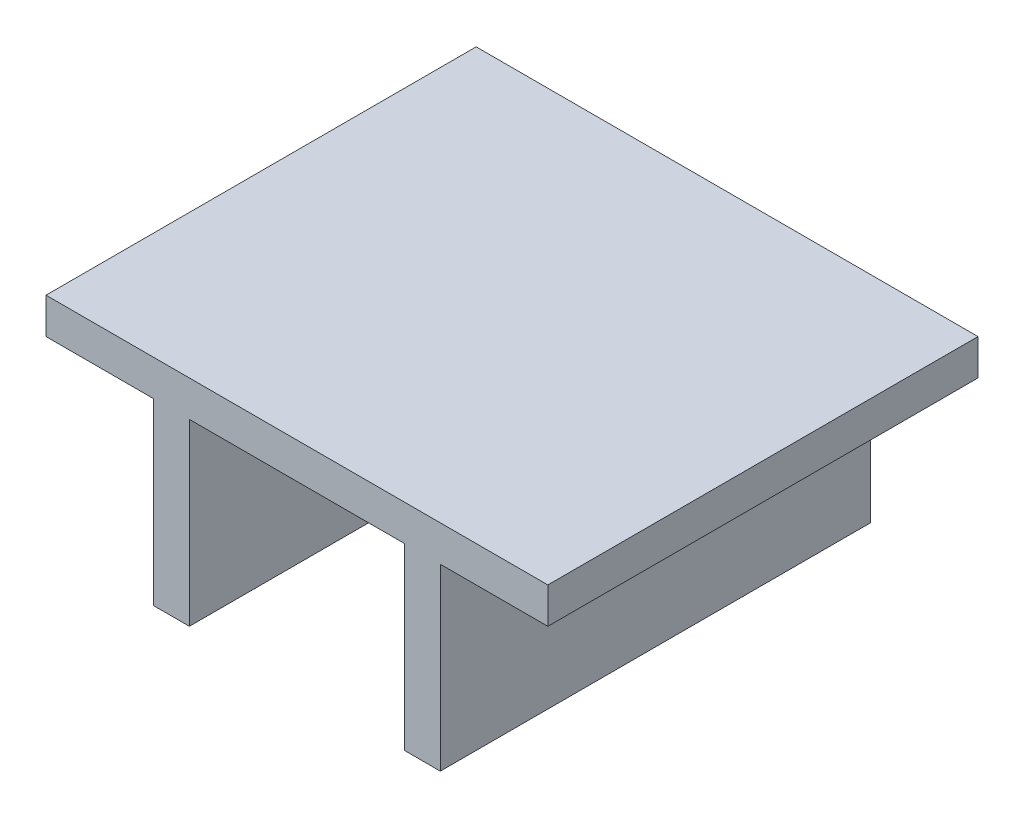
ISO-10303-21;
HEADER;
FILE_DESCRIPTION(('STEP AP214'),'2;1');
FILE_NAME('part.step','',(''),(''),'','','');
FILE_SCHEMA(('AUTOMOTIVE_DESIGN { 1 0 10303 214 1 1 1 1 }'));
ENDSEC;
DATA;
#1=APPLICATION_CONTEXT('core data for automotive mechanical design processes');
#2=APPLICATION_PROTOCOL_DEFINITION('international standard','automotive_design',2000,#1);
#3=PRODUCT_CONTEXT('',#1,'mechanical');
#4=PRODUCT('Part','Part','',(#3));
#5=PRODUCT_RELATED_PRODUCT_CATEGORY('part','',(#4));
#6=PRODUCT_DEFINITION_FORMATION('','',#4);
#7=PRODUCT_DEFINITION_CONTEXT('part definition',#1,'design');
#8=PRODUCT_DEFINITION('design','',#6,#7);
#9=PRODUCT_DEFINITION_SHAPE('','',#8);
#10=(LENGTH_UNIT() NAMED_UNIT(*) SI_UNIT(.MILLI.,.METRE.));
#11=(NAMED_UNIT(*) PLANE_ANGLE_UNIT() SI_UNIT($,.RADIAN.));
#12=(NAMED_UNIT(*) SI_UNIT($,.STERADIAN.) SOLID_ANGLE_UNIT());
#13=UNCERTAINTY_MEASURE_WITH_UNIT(LENGTH_MEASURE(1.E-05),#10,'distance_accuracy_value','');
#14=(GEOMETRIC_REPRESENTATION_CONTEXT(3) GLOBAL_UNCERTAINTY_ASSIGNED_CONTEXT((#13)) GLOBAL_UNIT_ASSIGNED_CONTEXT((#10,
#11,#12)) REPRESENTATION_CONTEXT('',''));
#15=CARTESIAN_POINT('',(0.,0.,0.));
#16=DIRECTION('',(0.,0.,1.));
#17=DIRECTION('',(1.,0.,0.));
#18=AXIS2_PLACEMENT_3D('',#15,#16,#17);
#19=CARTESIAN_POINT('',(0.,0.,76.2));
#20=DIRECTION('',(1.,0.,0.));
#21=DIRECTION('',(0.,1.,0.));
#22=AXIS2_PLACEMENT_3D('',#19,#20,#21);
#23=PLANE('',#22);
#24=DIRECTION('',(0.,-1.,0.));
#25=VECTOR('',#24,1.);
#26=CARTESIAN_POINT('',(0.,0.,0.));
#27=LINE('',#26,#25);
#28=CARTESIAN_POINT('',(0.,0.,0.));
#29=VERTEX_POINT('',#28);
#30=CARTESIAN_POINT('',(0.,-6.35,0.));
#31=VERTEX_POINT('',#30);
#32=EDGE_CURVE('E173',#29,#31,#27,.T.);
#33=ORIENTED_EDGE('',*,*,#32,.T.);
#34=DIRECTION('',(0.,0.,-1.));
#35=VECTOR('',#34,1.);
#36=CARTESIAN_POINT('',(0.,-6.35,76.2));
#37=LINE('',#36,#35);
#38=CARTESIAN_POINT('',(0.,-6.35,76.2));
#39=VERTEX_POINT('',#38);
#40=EDGE_CURVE('E11',#39,#31,#37,.T.);
#41=ORIENTED_EDGE('',*,*,#40,.F.);
#42=DIRECTION('',(0.,-1.,0.));
#43=VECTOR('',#42,1.);
#44=CARTESIAN_POINT('',(0.,0.,76.2));
#45=LINE('',#44,#43);
#46=CARTESIAN_POINT('',(0.,0.,76.2));
#47=VERTEX_POINT('',#46);
#48=EDGE_CURVE('E208',#47,#39,#45,.T.);
#49=ORIENTED_EDGE('',*,*,#48,.F.);
#50=DIRECTION('',(0.,0.,-1.));
#51=VECTOR('',#50,1.);
#52=CARTESIAN_POINT('',(0.,0.,76.2));
#53=LINE('',#52,#51);
#54=EDGE_CURVE('E62',#47,#29,#53,.T.);
#55=ORIENTED_EDGE('',*,*,#54,.T.);
#56=EDGE_LOOP('',(#33,#41,#49,#55));
#57=FACE_BOUND('',#56,.T.);
#58=ADVANCED_FACE('F45',(#57),#23,.F.);
#59=CARTESIAN_POINT('',(0.,-6.35,76.2));
#60=DIRECTION('',(0.,1.,0.));
#61=DIRECTION('',(-1.,0.,0.));
#62=AXIS2_PLACEMENT_3D('',#59,#60,#61);
#63=PLANE('',#62);
#64=DIRECTION('',(1.,0.,0.));
#65=VECTOR('',#64,1.);
#66=CARTESIAN_POINT('',(0.,-6.35,0.));
#67=LINE('',#66,#65);
#68=CARTESIAN_POINT('',(19.05,-6.35,0.));
#69=VERTEX_POINT('',#68);
#70=EDGE_CURVE('E176',#31,#69,#67,.T.);
#71=ORIENTED_EDGE('',*,*,#70,.T.);
#72=DIRECTION('',(0.,0.,-1.));
#73=VECTOR('',#72,1.);
#74=CARTESIAN_POINT('',(19.05,-6.35,76.2));
#75=LINE('',#74,#73);
#76=CARTESIAN_POINT('',(19.05,-6.35,76.2));
#77=VERTEX_POINT('',#76);
#78=EDGE_CURVE('E54',#77,#69,#75,.T.);
#79=ORIENTED_EDGE('',*,*,#78,.F.);
#80=DIRECTION('',(1.,0.,0.));
#81=VECTOR('',#80,1.);
#82=CARTESIAN_POINT('',(0.,-6.35,76.2));
#83=LINE('',#82,#81);
#84=EDGE_CURVE('E112',#39,#77,#83,.T.);
#85=ORIENTED_EDGE('',*,*,#84,.F.);
#86=ORIENTED_EDGE('',*,*,#40,.T.);
#87=EDGE_LOOP('',(#71,#79,#85,#86));
#88=FACE_BOUND('',#87,.T.);
#89=ADVANCED_FACE('F242',(#88),#63,.F.);
#90=CARTESIAN_POINT('',(19.05,0.,76.2));
#91=DIRECTION('',(-1.,0.,0.));
#92=DIRECTION('',(0.,0.,1.));
#93=AXIS2_PLACEMENT_3D('',#90,#91,#92);
#94=PLANE('',#93);
#95=DIRECTION('',(0.,1.,0.));
#96=VECTOR('',#95,1.);
#97=CARTESIAN_POINT('',(19.05,0.,0.));
#98=LINE('',#97,#96);
#99=CARTESIAN_POINT('',(19.05,-38.1,0.));
#100=VERTEX_POINT('',#99);
#101=EDGE_CURVE('E180',#100,#69,#98,.T.);
#102=ORIENTED_EDGE('',*,*,#101,.F.);
#103=DIRECTION('',(0.,0.,-1.));
#104=VECTOR('',#103,1.);
#105=CARTESIAN_POINT('',(19.05,-38.1,76.2));
#106=LINE('',#105,#104);
#107=CARTESIAN_POINT('',(19.05,-38.1,76.2));
#108=VERTEX_POINT('',#107);
#109=EDGE_CURVE('E233',#108,#100,#106,.T.);
#110=ORIENTED_EDGE('',*,*,#109,.F.);
#111=DIRECTION('',(0.,1.,0.));
#112=VECTOR('',#111,1.);
#113=CARTESIAN_POINT('',(19.05,0.,76.2));
#114=LINE('',#113,#112);
#115=EDGE_CURVE('E241',#108,#77,#114,.T.);
#116=ORIENTED_EDGE('',*,*,#115,.T.);
#117=ORIENTED_EDGE('',*,*,#78,.T.);
#118=EDGE_LOOP('',(#102,#110,#116,#117));
#119=FACE_BOUND('',#118,.T.);
#120=ADVANCED_FACE('F239',(#119),#94,.T.);
#121=CARTESIAN_POINT('',(0.,-38.1,76.2));
#122=DIRECTION('',(0.,1.,0.));
#123=DIRECTION('',(0.,0.,1.));
#124=AXIS2_PLACEMENT_3D('',#121,#122,#123);
#125=PLANE('',#124);
#126=DIRECTION('',(1.,0.,0.));
#127=VECTOR('',#126,1.);
#128=CARTESIAN_POINT('',(0.,-38.1,0.));
#129=LINE('',#128,#127);
#130=CARTESIAN_POINT('',(25.4,-38.1,0.));
#131=VERTEX_POINT('',#130);
#132=EDGE_CURVE('E185',#100,#131,#129,.T.);
#133=ORIENTED_EDGE('',*,*,#132,.T.);
#134=DIRECTION('',(0.,0.,-1.));
#135=VECTOR('',#134,1.);
#136=CARTESIAN_POINT('',(25.4,-38.1,76.2));
#137=LINE('',#136,#135);
#138=CARTESIAN_POINT('',(25.4,-38.1,76.2));
#139=VERTEX_POINT('',#138);
#140=EDGE_CURVE('E229',#139,#131,#137,.T.);
#141=ORIENTED_EDGE('',*,*,#140,.F.);
#142=DIRECTION('',(1.,0.,0.));
#143=VECTOR('',#142,1.);
#144=CARTESIAN_POINT('',(0.,-38.1,76.2));
#145=LINE('',#144,#143);
#146=EDGE_CURVE('E260',#108,#139,#145,.T.);
#147=ORIENTED_EDGE('',*,*,#146,.F.);
#148=ORIENTED_EDGE('',*,*,#109,.T.);
#149=EDGE_LOOP('',(#133,#141,#147,#148));
#150=FACE_BOUND('',#149,.T.);
#151=ADVANCED_FACE('F251',(#150),#125,.F.);
#152=CARTESIAN_POINT('',(25.4,0.,76.2));
#153=DIRECTION('',(-1.,0.,0.));
#154=DIRECTION('',(0.,0.,1.));
#155=AXIS2_PLACEMENT_3D('',#152,#153,#154);
#156=PLANE('',#155);
#157=DIRECTION('',(0.,1.,0.));
#158=VECTOR('',#157,1.);
#159=CARTESIAN_POINT('',(25.4,0.,0.));
#160=LINE('',#159,#158);
#161=CARTESIAN_POINT('',(25.4,-6.35,0.));
#162=VERTEX_POINT('',#161);
#163=EDGE_CURVE('E188',#131,#162,#160,.T.);
#164=ORIENTED_EDGE('',*,*,#163,.T.);
#165=DIRECTION('',(0.,0.,-1.));
#166=VECTOR('',#165,1.);
#167=CARTESIAN_POINT('',(25.4,-6.35,76.2));
#168=LINE('',#167,#166);
#169=CARTESIAN_POINT('',(25.4,-6.35,76.2));
#170=VERTEX_POINT('',#169);
#171=EDGE_CURVE('E225',#170,#162,#168,.T.);
#172=ORIENTED_EDGE('',*,*,#171,.F.);
#173=DIRECTION('',(0.,1.,0.));
#174=VECTOR('',#173,1.);
#175=CARTESIAN_POINT('',(25.4,0.,76.2));
#176=LINE('',#175,#174);
#177=EDGE_CURVE('E257',#139,#170,#176,.T.);
#178=ORIENTED_EDGE('',*,*,#177,.F.);
#179=ORIENTED_EDGE('',*,*,#140,.T.);
#180=EDGE_LOOP('',(#164,#172,#178,#179));
#181=FACE_BOUND('',#180,.T.);
#182=ADVANCED_FACE('F255',(#181),#156,.F.);
#183=CARTESIAN_POINT('',(63.5,-6.35,0.));
#184=VERTEX_POINT('',#183);
#185=EDGE_CURVE('E181',#162,#184,#67,.T.);
#186=ORIENTED_EDGE('',*,*,#185,.T.);
#187=DIRECTION('',(0.,0.,-1.));
#188=VECTOR('',#187,1.);
#189=CARTESIAN_POINT('',(63.5,-6.35,76.2));
#190=LINE('',#189,#188);
#191=CARTESIAN_POINT('',(63.5,-6.35,76.2));
#192=VERTEX_POINT('',#191);
#193=EDGE_CURVE('E222',#192,#184,#190,.T.);
#194=ORIENTED_EDGE('',*,*,#193,.F.);
#195=EDGE_CURVE('E153',#170,#192,#83,.T.);
#196=ORIENTED_EDGE('',*,*,#195,.F.);
#197=ORIENTED_EDGE('',*,*,#171,.T.);
#198=EDGE_LOOP('',(#186,#194,#196,#197));
#199=FACE_BOUND('',#198,.T.);
#200=ADVANCED_FACE('F287',(#199),#63,.F.);
#201=CARTESIAN_POINT('',(63.5,0.,76.2));
#202=DIRECTION('',(-1.,0.,0.));
#203=DIRECTION('',(0.,0.,1.));
#204=AXIS2_PLACEMENT_3D('',#201,#202,#203);
#205=PLANE('',#204);
#206=DIRECTION('',(0.,1.,0.));
#207=VECTOR('',#206,1.);
#208=CARTESIAN_POINT('',(63.5,0.,0.));
#209=LINE('',#208,#207);
#210=CARTESIAN_POINT('',(63.5,-38.1,0.));
#211=VERTEX_POINT('',#210);
#212=EDGE_CURVE('E191',#211,#184,#209,.T.);
#213=ORIENTED_EDGE('',*,*,#212,.F.);
#214=DIRECTION('',(0.,0.,-1.));
#215=VECTOR('',#214,1.);
#216=CARTESIAN_POINT('',(63.5,-38.1,76.2));
#217=LINE('',#216,#215);
#218=CARTESIAN_POINT('',(63.5,-38.1,76.2));
#219=VERTEX_POINT('',#218);
#220=EDGE_CURVE('E219',#219,#211,#217,.T.);
#221=ORIENTED_EDGE('',*,*,#220,.F.);
#222=DIRECTION('',(0.,1.,0.));
#223=VECTOR('',#222,1.);
#224=CARTESIAN_POINT('',(63.5,0.,76.2));
#225=LINE('',#224,#223);
#226=EDGE_CURVE('E264',#219,#192,#225,.T.);
#227=ORIENTED_EDGE('',*,*,#226,.T.);
#228=ORIENTED_EDGE('',*,*,#193,.T.);
#229=EDGE_LOOP('',(#213,#221,#227,#228));
#230=FACE_BOUND('',#229,.T.);
#231=ADVANCED_FACE('F290',(#230),#205,.T.);
#232=CARTESIAN_POINT('',(0.,-38.1,76.2));
#233=DIRECTION('',(0.,1.,0.));
#234=DIRECTION('',(0.,0.,1.));
#235=AXIS2_PLACEMENT_3D('',#232,#233,#234);
#236=PLANE('',#235);
#237=DIRECTION('',(1.,0.,0.));
#238=VECTOR('',#237,1.);
#239=CARTESIAN_POINT('',(0.,-38.1,0.));
#240=LINE('',#239,#238);
#241=CARTESIAN_POINT('',(69.85,-38.1,0.));
#242=VERTEX_POINT('',#241);
#243=EDGE_CURVE('E195',#211,#242,#240,.T.);
#244=ORIENTED_EDGE('',*,*,#243,.T.);
#245=DIRECTION('',(0.,0.,-1.));
#246=VECTOR('',#245,1.);
#247=CARTESIAN_POINT('',(69.85,-38.1,76.2));
#248=LINE('',#247,#246);
#249=CARTESIAN_POINT('',(69.85,-38.1,76.2));
#250=VERTEX_POINT('',#249);
#251=EDGE_CURVE('E215',#250,#242,#248,.T.);
#252=ORIENTED_EDGE('',*,*,#251,.F.);
#253=DIRECTION('',(1.,0.,0.));
#254=VECTOR('',#253,1.);
#255=CARTESIAN_POINT('',(0.,-38.1,76.2));
#256=LINE('',#255,#254);
#257=EDGE_CURVE('E270',#219,#250,#256,.T.);
#258=ORIENTED_EDGE('',*,*,#257,.F.);
#259=ORIENTED_EDGE('',*,*,#220,.T.);
#260=EDGE_LOOP('',(#244,#252,#258,#259));
#261=FACE_BOUND('',#260,.T.);
#262=ADVANCED_FACE('F277',(#261),#236,.F.);
#263=CARTESIAN_POINT('',(69.85,0.,76.2));
#264=DIRECTION('',(-1.,0.,0.));
#265=DIRECTION('',(0.,0.,1.));
#266=AXIS2_PLACEMENT_3D('',#263,#264,#265);
#267=PLANE('',#266);
#268=DIRECTION('',(0.,1.,0.));
#269=VECTOR('',#268,1.);
#270=CARTESIAN_POINT('',(69.85,0.,0.));
#271=LINE('',#270,#269);
#272=CARTESIAN_POINT('',(69.85,-6.35,0.));
#273=VERTEX_POINT('',#272);
#274=EDGE_CURVE('E198',#242,#273,#271,.T.);
#275=ORIENTED_EDGE('',*,*,#274,.T.);
#276=DIRECTION('',(0.,0.,-1.));
#277=VECTOR('',#276,1.);
#278=CARTESIAN_POINT('',(69.85,-6.35,76.2));
#279=LINE('',#278,#277);
#280=CARTESIAN_POINT('',(69.85,-6.35,76.2));
#281=VERTEX_POINT('',#280);
#282=EDGE_CURVE('E162',#281,#273,#279,.T.);
#283=ORIENTED_EDGE('',*,*,#282,.F.);
#284=DIRECTION('',(0.,1.,0.));
#285=VECTOR('',#284,1.);
#286=CARTESIAN_POINT('',(69.85,0.,76.2));
#287=LINE('',#286,#285);
#288=EDGE_CURVE('E147',#250,#281,#287,.T.);
#289=ORIENTED_EDGE('',*,*,#288,.F.);
#290=ORIENTED_EDGE('',*,*,#251,.T.);
#291=EDGE_LOOP('',(#275,#283,#289,#290));
#292=FACE_BOUND('',#291,.T.);
#293=ADVANCED_FACE('F281',(#292),#267,.F.);
#294=CARTESIAN_POINT('',(88.9,-6.35,0.));
#295=VERTEX_POINT('',#294);
#296=EDGE_CURVE('E158',#273,#295,#67,.T.);
#297=ORIENTED_EDGE('',*,*,#296,.T.);
#298=DIRECTION('',(0.,0.,-1.));
#299=VECTOR('',#298,1.);
#300=CARTESIAN_POINT('',(88.9,-6.35,76.2));
#301=LINE('',#300,#299);
#302=CARTESIAN_POINT('',(88.9,-6.35,76.2));
#303=VERTEX_POINT('',#302);
#304=EDGE_CURVE('E155',#303,#295,#301,.T.);
#305=ORIENTED_EDGE('',*,*,#304,.F.);
#306=EDGE_CURVE('E140',#281,#303,#83,.T.);
#307=ORIENTED_EDGE('',*,*,#306,.F.);
#308=ORIENTED_EDGE('',*,*,#282,.T.);
#309=EDGE_LOOP('',(#297,#305,#307,#308));
#310=FACE_BOUND('',#309,.T.);
#311=ADVANCED_FACE('F156',(#310),#63,.F.);
#312=CARTESIAN_POINT('',(88.9,0.,76.2));
#313=DIRECTION('',(1.,0.,0.));
#314=DIRECTION('',(0.,1.,0.));
#315=AXIS2_PLACEMENT_3D('',#312,#313,#314);
#316=PLANE('',#315);
#317=DIRECTION('',(0.,-1.,0.));
#318=VECTOR('',#317,1.);
#319=CARTESIAN_POINT('',(88.9,0.,0.));
#320=LINE('',#319,#318);
#321=CARTESIAN_POINT('',(88.9,0.,0.));
#322=VERTEX_POINT('',#321);
#323=EDGE_CURVE('E201',#322,#295,#320,.T.);
#324=ORIENTED_EDGE('',*,*,#323,.F.);
#325=DIRECTION('',(0.,0.,-1.));
#326=VECTOR('',#325,1.);
#327=CARTESIAN_POINT('',(88.9,0.,76.2));
#328=LINE('',#327,#326);
#329=CARTESIAN_POINT('',(88.9,0.,76.2));
#330=VERTEX_POINT('',#329);
#331=EDGE_CURVE('E100',#330,#322,#328,.T.);
#332=ORIENTED_EDGE('',*,*,#331,.F.);
#333=DIRECTION('',(0.,-1.,0.));
#334=VECTOR('',#333,1.);
#335=CARTESIAN_POINT('',(88.9,0.,76.2));
#336=LINE('',#335,#334);
#337=EDGE_CURVE('E145',#330,#303,#336,.T.);
#338=ORIENTED_EDGE('',*,*,#337,.T.);
#339=ORIENTED_EDGE('',*,*,#304,.T.);
#340=EDGE_LOOP('',(#324,#332,#338,#339));
#341=FACE_BOUND('',#340,.T.);
#342=ADVANCED_FACE('F164',(#341),#316,.T.);
#343=CARTESIAN_POINT('',(0.,0.,76.2));
#344=DIRECTION('',(0.,1.,0.));
#345=DIRECTION('',(0.,0.,1.));
#346=AXIS2_PLACEMENT_3D('',#343,#344,#345);
#347=PLANE('',#346);
#348=DIRECTION('',(1.,0.,0.));
#349=VECTOR('',#348,1.);
#350=CARTESIAN_POINT('',(0.,0.,0.));
#351=LINE('',#350,#349);
#352=EDGE_CURVE('E204',#29,#322,#351,.T.);
#353=ORIENTED_EDGE('',*,*,#352,.F.);
#354=ORIENTED_EDGE('',*,*,#54,.F.);
#355=DIRECTION('',(1.,0.,0.));
#356=VECTOR('',#355,1.);
#357=CARTESIAN_POINT('',(0.,0.,76.2));
#358=LINE('',#357,#356);
#359=EDGE_CURVE('E166',#47,#330,#358,.T.);
#360=ORIENTED_EDGE('',*,*,#359,.T.);
#361=ORIENTED_EDGE('',*,*,#331,.T.);
#362=EDGE_LOOP('',(#353,#354,#360,#361));
#363=FACE_BOUND('',#362,.T.);
#364=ADVANCED_FACE('F304',(#363),#347,.T.);
#365=CARTESIAN_POINT('',(0.,0.,76.2));
#366=DIRECTION('',(0.,0.,1.));
#367=DIRECTION('',(1.,0.,0.));
#368=AXIS2_PLACEMENT_3D('',#365,#366,#367);
#369=PLANE('',#368);
#370=ORIENTED_EDGE('',*,*,#48,.T.);
#371=ORIENTED_EDGE('',*,*,#84,.T.);
#372=ORIENTED_EDGE('',*,*,#115,.F.);
#373=ORIENTED_EDGE('',*,*,#146,.T.);
#374=ORIENTED_EDGE('',*,*,#177,.T.);
#375=ORIENTED_EDGE('',*,*,#195,.T.);
#376=ORIENTED_EDGE('',*,*,#226,.F.);
#377=ORIENTED_EDGE('',*,*,#257,.T.);
#378=ORIENTED_EDGE('',*,*,#288,.T.);
#379=ORIENTED_EDGE('',*,*,#306,.T.);
#380=ORIENTED_EDGE('',*,*,#337,.F.);
#381=ORIENTED_EDGE('',*,*,#359,.F.);
#382=EDGE_LOOP('',(#370,#371,#372,#373,#374,#375,#376,#377,#378,#379,#380,#381));
#383=FACE_BOUND('',#382,.T.);
#384=ADVANCED_FACE('F142',(#383),#369,.T.);
#385=CARTESIAN_POINT('',(0.,0.,0.));
#386=DIRECTION('',(0.,0.,1.));
#387=DIRECTION('',(1.,0.,0.));
#388=AXIS2_PLACEMENT_3D('',#385,#386,#387);
#389=PLANE('',#388);
#390=ORIENTED_EDGE('',*,*,#32,.F.);
#391=ORIENTED_EDGE('',*,*,#352,.T.);
#392=ORIENTED_EDGE('',*,*,#323,.T.);
#393=ORIENTED_EDGE('',*,*,#296,.F.);
#394=ORIENTED_EDGE('',*,*,#274,.F.);
#395=ORIENTED_EDGE('',*,*,#243,.F.);
#396=ORIENTED_EDGE('',*,*,#212,.T.);
#397=ORIENTED_EDGE('',*,*,#185,.F.);
#398=ORIENTED_EDGE('',*,*,#163,.F.);
#399=ORIENTED_EDGE('',*,*,#132,.F.);
#400=ORIENTED_EDGE('',*,*,#101,.T.);
#401=ORIENTED_EDGE('',*,*,#70,.F.);
#402=EDGE_LOOP('',(#390,#391,#392,#393,#394,#395,#396,#397,#398,#399,#400,#401));
#403=FACE_BOUND('',#402,.T.);
#404=ADVANCED_FACE('F246',(#403),#389,.F.);
#405=CLOSED_SHELL('',(#58,#89,#120,#151,#182,#200,#231,#262,#293,#311,#342,#364,#384,#404));
#406=MANIFOLD_SOLID_BREP('B2',#405);
#407=ADVANCED_BREP_SHAPE_REPRESENTATION('',(#18,#406),#14);
#408=SHAPE_DEFINITION_REPRESENTATION(#9,#407);
ENDSEC;
END-ISO-10303-21;
